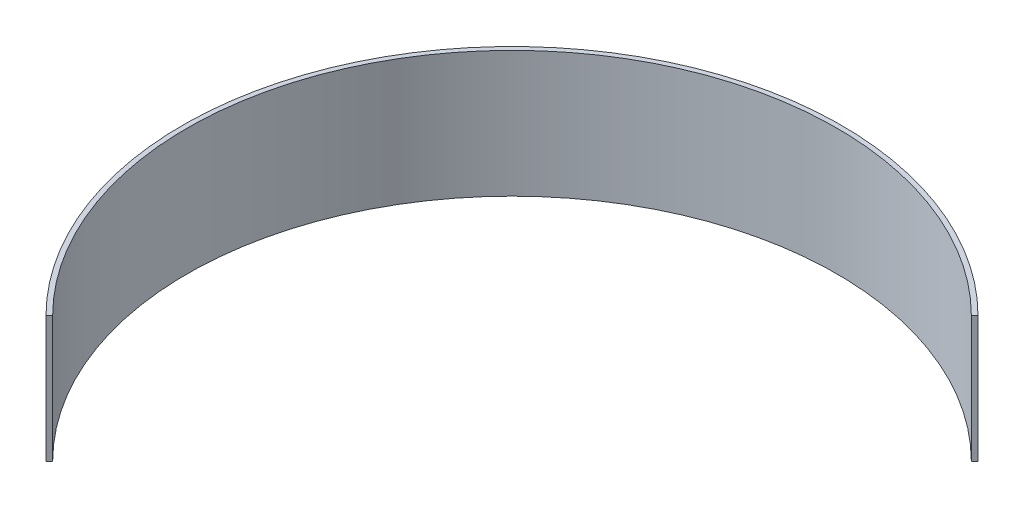
ISO-10303-21;
HEADER;
FILE_DESCRIPTION(('STEP AP214'),'2;1');
FILE_NAME('part.step','',(''),(''),'','','');
FILE_SCHEMA(('AUTOMOTIVE_DESIGN { 1 0 10303 214 1 1 1 1 }'));
ENDSEC;
DATA;
#1=APPLICATION_CONTEXT('core data for automotive mechanical design processes');
#2=APPLICATION_PROTOCOL_DEFINITION('international standard','automotive_design',2000,#1);
#3=PRODUCT_CONTEXT('',#1,'mechanical');
#4=PRODUCT('Part','Part','',(#3));
#5=PRODUCT_RELATED_PRODUCT_CATEGORY('part','',(#4));
#6=PRODUCT_DEFINITION_FORMATION('','',#4);
#7=PRODUCT_DEFINITION_CONTEXT('part definition',#1,'design');
#8=PRODUCT_DEFINITION('design','',#6,#7);
#9=PRODUCT_DEFINITION_SHAPE('','',#8);
#10=(LENGTH_UNIT() NAMED_UNIT(*) SI_UNIT(.MILLI.,.METRE.));
#11=(NAMED_UNIT(*) PLANE_ANGLE_UNIT() SI_UNIT($,.RADIAN.));
#12=(NAMED_UNIT(*) SI_UNIT($,.STERADIAN.) SOLID_ANGLE_UNIT());
#13=UNCERTAINTY_MEASURE_WITH_UNIT(LENGTH_MEASURE(1.E-05),#10,'distance_accuracy_value','');
#14=(GEOMETRIC_REPRESENTATION_CONTEXT(3) GLOBAL_UNCERTAINTY_ASSIGNED_CONTEXT((#13)) GLOBAL_UNIT_ASSIGNED_CONTEXT((#10,
#11,#12)) REPRESENTATION_CONTEXT('',''));
#15=CARTESIAN_POINT('',(0.,0.,0.));
#16=DIRECTION('',(0.,0.,1.));
#17=DIRECTION('',(1.,0.,0.));
#18=AXIS2_PLACEMENT_3D('',#15,#16,#17);
#19=CARTESIAN_POINT('',(3.38618022510673E-12,3697.,3.38618022510673E-12));
#20=DIRECTION('',(0.,1.,0.));
#21=DIRECTION('',(0.,0.,1.));
#22=AXIS2_PLACEMENT_3D('',#19,#20,#21);
#23=PLANE('',#22);
#24=DIRECTION('',(-0.707106781186554,0.,0.707106781186541));
#25=VECTOR('',#24,1.);
#26=CARTESIAN_POINT('',(-396.686904245653,3697.,396.686904245653));
#27=LINE('',#26,#25);
#28=CARTESIAN_POINT('',(-391.030049996161,3697.,391.03004999616));
#29=VERTEX_POINT('',#28);
#30=CARTESIAN_POINT('',(-396.686904245653,3697.,396.686904245653));
#31=VERTEX_POINT('',#30);
#32=EDGE_CURVE('E11',#29,#31,#27,.T.);
#33=ORIENTED_EDGE('',*,*,#32,.F.);
#34=CARTESIAN_POINT('',(3.38618022510673E-12,3697.,3.38618022510673E-12));
#35=DIRECTION('',(0.,-1.,0.));
#36=DIRECTION('',(0.,0.,-1.));
#37=AXIS2_PLACEMENT_3D('',#34,#35,#36);
#38=CIRCLE('',#37,553.);
#39=CARTESIAN_POINT('',(391.03004999617,3697.,-391.030049996151));
#40=VERTEX_POINT('',#39);
#41=EDGE_CURVE('E72',#29,#40,#38,.T.);
#42=ORIENTED_EDGE('',*,*,#41,.T.);
#43=DIRECTION('',(0.707106781186559,0.,-0.707106781186536));
#44=VECTOR('',#43,1.);
#45=CARTESIAN_POINT('',(396.686904245663,3697.,-396.686904245643));
#46=LINE('',#45,#44);
#47=CARTESIAN_POINT('',(396.686904245663,3697.,-396.686904245643));
#48=VERTEX_POINT('',#47);
#49=EDGE_CURVE('E46',#40,#48,#46,.T.);
#50=ORIENTED_EDGE('',*,*,#49,.T.);
#51=CARTESIAN_POINT('',(3.38618022510673E-12,3697.,3.38618022510673E-12));
#52=DIRECTION('',(0.,-1.,0.));
#53=DIRECTION('',(0.,0.,-1.));
#54=AXIS2_PLACEMENT_3D('',#51,#52,#53);
#55=CIRCLE('',#54,561.);
#56=EDGE_CURVE('E75',#31,#48,#55,.T.);
#57=ORIENTED_EDGE('',*,*,#56,.F.);
#58=EDGE_LOOP('',(#33,#42,#50,#57));
#59=FACE_BOUND('',#58,.T.);
#60=ADVANCED_FACE('F36',(#59),#23,.T.);
#61=CARTESIAN_POINT('',(396.686904245663,3589.5,-396.686904245643));
#62=DIRECTION('',(0.707106781186536,0.,0.707106781186559));
#63=DIRECTION('',(0.,-1.,0.));
#64=AXIS2_PLACEMENT_3D('',#61,#62,#63);
#65=PLANE('',#64);
#66=ORIENTED_EDGE('',*,*,#49,.F.);
#67=DIRECTION('',(0.,-1.,0.));
#68=VECTOR('',#67,1.);
#69=CARTESIAN_POINT('',(391.03004999617,5354.81102399645,-391.030049996151));
#70=LINE('',#69,#68);
#71=CARTESIAN_POINT('',(391.03004999617,3482.,-391.030049996151));
#72=VERTEX_POINT('',#71);
#73=EDGE_CURVE('E87',#40,#72,#70,.T.);
#74=ORIENTED_EDGE('',*,*,#73,.T.);
#75=DIRECTION('',(0.707106781186558,0.,-0.707106781186537));
#76=VECTOR('',#75,1.);
#77=CARTESIAN_POINT('',(396.686904245663,3482.,-396.686904245644));
#78=LINE('',#77,#76);
#79=CARTESIAN_POINT('',(396.686904245663,3482.,-396.686904245644));
#80=VERTEX_POINT('',#79);
#81=EDGE_CURVE('E96',#72,#80,#78,.T.);
#82=ORIENTED_EDGE('',*,*,#81,.T.);
#83=DIRECTION('',(0.,-1.,0.));
#84=VECTOR('',#83,1.);
#85=CARTESIAN_POINT('',(396.686904245663,3697.,-396.686904245643));
#86=LINE('',#85,#84);
#87=EDGE_CURVE('E91',#48,#80,#86,.T.);
#88=ORIENTED_EDGE('',*,*,#87,.F.);
#89=EDGE_LOOP('',(#66,#74,#82,#88));
#90=FACE_BOUND('',#89,.T.);
#91=ADVANCED_FACE('F104',(#90),#65,.T.);
#92=CARTESIAN_POINT('',(3.38618022510673E-12,3482.,3.38618022510673E-12));
#93=DIRECTION('',(0.,-1.,0.));
#94=DIRECTION('',(0.,0.,-1.));
#95=AXIS2_PLACEMENT_3D('',#92,#93,#94);
#96=PLANE('',#95);
#97=ORIENTED_EDGE('',*,*,#81,.F.);
#98=CARTESIAN_POINT('',(3.38618022510673E-12,3482.,3.38618022510673E-12));
#99=DIRECTION('',(0.,-1.,0.));
#100=DIRECTION('',(0.,0.,-1.));
#101=AXIS2_PLACEMENT_3D('',#98,#99,#100);
#102=CIRCLE('',#101,553.);
#103=CARTESIAN_POINT('',(-391.030049996161,3482.,391.03004999616));
#104=VERTEX_POINT('',#103);
#105=EDGE_CURVE('E89',#72,#104,#102,.F.);
#106=ORIENTED_EDGE('',*,*,#105,.T.);
#107=DIRECTION('',(-0.707106781186554,0.,0.70710678118654));
#108=VECTOR('',#107,1.);
#109=CARTESIAN_POINT('',(-396.686904245654,3482.,396.686904245653));
#110=LINE('',#109,#108);
#111=CARTESIAN_POINT('',(-396.686904245654,3482.,396.686904245653));
#112=VERTEX_POINT('',#111);
#113=EDGE_CURVE('E40',#104,#112,#110,.T.);
#114=ORIENTED_EDGE('',*,*,#113,.T.);
#115=CARTESIAN_POINT('',(3.38618022510673E-12,3482.,3.38618022510673E-12));
#116=DIRECTION('',(0.,1.,0.));
#117=DIRECTION('',(0.,0.,1.));
#118=AXIS2_PLACEMENT_3D('',#115,#116,#117);
#119=CIRCLE('',#118,561.);
#120=EDGE_CURVE('E105',#80,#112,#119,.T.);
#121=ORIENTED_EDGE('',*,*,#120,.F.);
#122=EDGE_LOOP('',(#97,#106,#114,#121));
#123=FACE_BOUND('',#122,.T.);
#124=ADVANCED_FACE('F109',(#123),#96,.T.);
#125=CARTESIAN_POINT('',(-396.686904245654,3589.5,396.686904245653));
#126=DIRECTION('',(0.707106781186541,0.,0.707106781186554));
#127=DIRECTION('',(0.,1.,0.));
#128=AXIS2_PLACEMENT_3D('',#125,#126,#127);
#129=PLANE('',#128);
#130=DIRECTION('',(0.,-1.,0.));
#131=VECTOR('',#130,1.);
#132=CARTESIAN_POINT('',(-391.030049996161,5354.81102399645,391.03004999616));
#133=LINE('',#132,#131);
#134=EDGE_CURVE('E85',#104,#29,#133,.F.);
#135=ORIENTED_EDGE('',*,*,#134,.T.);
#136=ORIENTED_EDGE('',*,*,#32,.T.);
#137=DIRECTION('',(0.,1.,0.));
#138=VECTOR('',#137,1.);
#139=CARTESIAN_POINT('',(-396.686904245654,3482.,396.686904245653));
#140=LINE('',#139,#138);
#141=EDGE_CURVE('E103',#112,#31,#140,.T.);
#142=ORIENTED_EDGE('',*,*,#141,.F.);
#143=ORIENTED_EDGE('',*,*,#113,.F.);
#144=EDGE_LOOP('',(#135,#136,#142,#143));
#145=FACE_BOUND('',#144,.T.);
#146=ADVANCED_FACE('F38',(#145),#129,.T.);
#147=CARTESIAN_POINT('',(3.38618022510673E-12,5354.81102399645,3.38618022510673E-12));
#148=DIRECTION('',(0.,-1.,0.));
#149=DIRECTION('',(0.,0.,-1.));
#150=AXIS2_PLACEMENT_3D('',#147,#148,#149);
#151=CYLINDRICAL_SURFACE('',#150,561.);
#152=ORIENTED_EDGE('',*,*,#120,.T.);
#153=ORIENTED_EDGE('',*,*,#141,.T.);
#154=ORIENTED_EDGE('',*,*,#56,.T.);
#155=ORIENTED_EDGE('',*,*,#87,.T.);
#156=EDGE_LOOP('',(#152,#153,#154,#155));
#157=FACE_BOUND('',#156,.T.);
#158=ADVANCED_FACE('F102',(#157),#151,.T.);
#159=CARTESIAN_POINT('',(3.38618022510673E-12,5354.81102399645,3.38618022510673E-12));
#160=DIRECTION('',(0.,-1.,0.));
#161=DIRECTION('',(0.,0.,-1.));
#162=AXIS2_PLACEMENT_3D('',#159,#160,#161);
#163=CYLINDRICAL_SURFACE('',#162,553.);
#164=ORIENTED_EDGE('',*,*,#105,.F.);
#165=ORIENTED_EDGE('',*,*,#73,.F.);
#166=ORIENTED_EDGE('',*,*,#41,.F.);
#167=ORIENTED_EDGE('',*,*,#134,.F.);
#168=EDGE_LOOP('',(#164,#165,#166,#167));
#169=FACE_BOUND('',#168,.T.);
#170=ADVANCED_FACE('F84',(#169),#163,.F.);
#171=CLOSED_SHELL('',(#60,#91,#124,#146,#158,#170));
#172=MANIFOLD_SOLID_BREP('B2',#171);
#173=ADVANCED_BREP_SHAPE_REPRESENTATION('',(#18,#172),#14);
#174=SHAPE_DEFINITION_REPRESENTATION(#9,#173);
ENDSEC;
END-ISO-10303-21;
